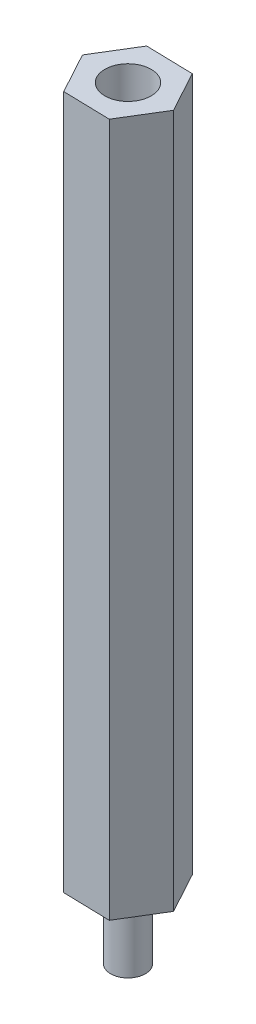
ISO-10303-21;
HEADER;
FILE_DESCRIPTION(('STEP AP214'),'2;1');
FILE_NAME('part.step','',(''),(''),'','','');
FILE_SCHEMA(('AUTOMOTIVE_DESIGN { 1 0 10303 214 1 1 1 1 }'));
ENDSEC;
DATA;
#1=APPLICATION_CONTEXT('core data for automotive mechanical design processes');
#2=APPLICATION_PROTOCOL_DEFINITION('international standard','automotive_design',2000,#1);
#3=PRODUCT_CONTEXT('',#1,'mechanical');
#4=PRODUCT('Part','Part','',(#3));
#5=PRODUCT_RELATED_PRODUCT_CATEGORY('part','',(#4));
#6=PRODUCT_DEFINITION_FORMATION('','',#4);
#7=PRODUCT_DEFINITION_CONTEXT('part definition',#1,'design');
#8=PRODUCT_DEFINITION('design','',#6,#7);
#9=PRODUCT_DEFINITION_SHAPE('','',#8);
#10=(LENGTH_UNIT() NAMED_UNIT(*) SI_UNIT(.MILLI.,.METRE.));
#11=(NAMED_UNIT(*) PLANE_ANGLE_UNIT() SI_UNIT($,.RADIAN.));
#12=(NAMED_UNIT(*) SI_UNIT($,.STERADIAN.) SOLID_ANGLE_UNIT());
#13=UNCERTAINTY_MEASURE_WITH_UNIT(LENGTH_MEASURE(1.E-05),#10,'distance_accuracy_value','');
#14=(GEOMETRIC_REPRESENTATION_CONTEXT(3) GLOBAL_UNCERTAINTY_ASSIGNED_CONTEXT((#13)) GLOBAL_UNIT_ASSIGNED_CONTEXT((#10,
#11,#12)) REPRESENTATION_CONTEXT('',''));
#15=CARTESIAN_POINT('',(0.,0.,0.));
#16=DIRECTION('',(0.,0.,1.));
#17=DIRECTION('',(1.,0.,0.));
#18=AXIS2_PLACEMENT_3D('',#15,#16,#17);
#19=CARTESIAN_POINT('',(-2.10856113065434,60.,3.44779687505326));
#20=DIRECTION('',(0.0252802878709683,0.,-0.999680402451284));
#21=DIRECTION('',(-0.999680402451284,0.,-0.0252802878709683));
#22=AXIS2_PLACEMENT_3D('',#19,#20,#21);
#23=PLANE('',#22);
#24=DIRECTION('',(0.999680402451284,0.,0.0252802878709683));
#25=VECTOR('',#24,1.);
#26=CARTESIAN_POINT('',(-2.10856113065434,0.,3.44779687505326));
#27=LINE('',#26,#25);
#28=CARTESIAN_POINT('',(-2.10856113065434,0.,3.44779687505326));
#29=VERTEX_POINT('',#28);
#30=CARTESIAN_POINT('',(1.93159911555756,0.,3.54996594210573));
#31=VERTEX_POINT('',#30);
#32=EDGE_CURVE('E125',#29,#31,#27,.T.);
#33=ORIENTED_EDGE('',*,*,#32,.T.);
#34=DIRECTION('',(0.,-1.,0.));
#35=VECTOR('',#34,1.);
#36=CARTESIAN_POINT('',(1.93159911555756,60.,3.54996594210573));
#37=LINE('',#36,#35);
#38=CARTESIAN_POINT('',(1.93159911555756,60.,3.54996594210573));
#39=VERTEX_POINT('',#38);
#40=EDGE_CURVE('E42',#39,#31,#37,.T.);
#41=ORIENTED_EDGE('',*,*,#40,.F.);
#42=DIRECTION('',(0.999680402451284,0.,0.0252802878709683));
#43=VECTOR('',#42,1.);
#44=CARTESIAN_POINT('',(-2.10856113065434,60.,3.44779687505326));
#45=LINE('',#44,#43);
#46=CARTESIAN_POINT('',(-2.10856113065434,60.,3.44779687505326));
#47=VERTEX_POINT('',#46);
#48=EDGE_CURVE('E136',#47,#39,#45,.T.);
#49=ORIENTED_EDGE('',*,*,#48,.F.);
#50=DIRECTION('',(0.,-1.,0.));
#51=VECTOR('',#50,1.);
#52=CARTESIAN_POINT('',(-2.10856113065434,60.,3.44779687505326));
#53=LINE('',#52,#51);
#54=EDGE_CURVE('E121',#47,#29,#53,.T.);
#55=ORIENTED_EDGE('',*,*,#54,.T.);
#56=EDGE_LOOP('',(#33,#41,#49,#55));
#57=FACE_BOUND('',#56,.T.);
#58=ADVANCED_FACE('F39',(#57),#23,.F.);
#59=CARTESIAN_POINT('',(1.93159911555756,60.,3.54996594210573));
#60=DIRECTION('',(-0.853108480252779,0.,-0.521733572736884));
#61=DIRECTION('',(-0.521733572736884,0.,0.853108480252779));
#62=AXIS2_PLACEMENT_3D('',#59,#60,#61);
#63=PLANE('',#62);
#64=DIRECTION('',(0.521733572736884,0.,-0.853108480252779));
#65=VECTOR('',#64,1.);
#66=CARTESIAN_POINT('',(1.93159911555756,0.,3.54996594210573));
#67=LINE('',#66,#65);
#68=CARTESIAN_POINT('',(4.0401602462119,0.,0.102169067052462));
#69=VERTEX_POINT('',#68);
#70=EDGE_CURVE('E128',#31,#69,#67,.T.);
#71=ORIENTED_EDGE('',*,*,#70,.T.);
#72=DIRECTION('',(0.,-1.,0.));
#73=VECTOR('',#72,1.);
#74=CARTESIAN_POINT('',(4.0401602462119,60.,0.102169067052462));
#75=LINE('',#74,#73);
#76=CARTESIAN_POINT('',(4.0401602462119,60.,0.102169067052462));
#77=VERTEX_POINT('',#76);
#78=EDGE_CURVE('E139',#77,#69,#75,.T.);
#79=ORIENTED_EDGE('',*,*,#78,.F.);
#80=DIRECTION('',(0.521733572736884,0.,-0.853108480252779));
#81=VECTOR('',#80,1.);
#82=CARTESIAN_POINT('',(1.93159911555756,60.,3.54996594210573));
#83=LINE('',#82,#81);
#84=EDGE_CURVE('E94',#39,#77,#83,.T.);
#85=ORIENTED_EDGE('',*,*,#84,.F.);
#86=ORIENTED_EDGE('',*,*,#40,.T.);
#87=EDGE_LOOP('',(#71,#79,#85,#86));
#88=FACE_BOUND('',#87,.T.);
#89=ADVANCED_FACE('F144',(#88),#63,.F.);
#90=CARTESIAN_POINT('',(4.0401602462119,60.,0.102169067052462));
#91=DIRECTION('',(-0.878388768123747,0.,0.4779468297144));
#92=DIRECTION('',(0.4779468297144,0.,0.878388768123747));
#93=AXIS2_PLACEMENT_3D('',#90,#91,#92);
#94=PLANE('',#93);
#95=DIRECTION('',(-0.4779468297144,0.,-0.878388768123747));
#96=VECTOR('',#95,1.);
#97=CARTESIAN_POINT('',(4.0401602462119,0.,0.102169067052462));
#98=LINE('',#97,#96);
#99=CARTESIAN_POINT('',(2.10856113065434,0.,-3.44779687505326));
#100=VERTEX_POINT('',#99);
#101=EDGE_CURVE('E131',#69,#100,#98,.T.);
#102=ORIENTED_EDGE('',*,*,#101,.T.);
#103=DIRECTION('',(0.,-1.,0.));
#104=VECTOR('',#103,1.);
#105=CARTESIAN_POINT('',(2.10856113065434,60.,-3.44779687505326));
#106=LINE('',#105,#104);
#107=CARTESIAN_POINT('',(2.10856113065434,60.,-3.44779687505326));
#108=VERTEX_POINT('',#107);
#109=EDGE_CURVE('E116',#108,#100,#106,.T.);
#110=ORIENTED_EDGE('',*,*,#109,.F.);
#111=DIRECTION('',(-0.4779468297144,0.,-0.878388768123747));
#112=VECTOR('',#111,1.);
#113=CARTESIAN_POINT('',(4.0401602462119,60.,0.102169067052462));
#114=LINE('',#113,#112);
#115=EDGE_CURVE('E107',#77,#108,#114,.T.);
#116=ORIENTED_EDGE('',*,*,#115,.F.);
#117=ORIENTED_EDGE('',*,*,#78,.T.);
#118=EDGE_LOOP('',(#102,#110,#116,#117));
#119=FACE_BOUND('',#118,.T.);
#120=ADVANCED_FACE('F150',(#119),#94,.F.);
#121=CARTESIAN_POINT('',(2.10856113065434,60.,-3.44779687505326));
#122=DIRECTION('',(-0.0252802878709679,0.,0.999680402451284));
#123=DIRECTION('',(0.999680402451284,0.,0.0252802878709679));
#124=AXIS2_PLACEMENT_3D('',#121,#122,#123);
#125=PLANE('',#124);
#126=DIRECTION('',(-0.999680402451284,0.,-0.0252802878709679));
#127=VECTOR('',#126,1.);
#128=CARTESIAN_POINT('',(2.10856113065434,0.,-3.44779687505326));
#129=LINE('',#128,#127);
#130=CARTESIAN_POINT('',(-1.93159911555756,0.,-3.54996594210573));
#131=VERTEX_POINT('',#130);
#132=EDGE_CURVE('E115',#100,#131,#129,.T.);
#133=ORIENTED_EDGE('',*,*,#132,.T.);
#134=DIRECTION('',(0.,-1.,0.));
#135=VECTOR('',#134,1.);
#136=CARTESIAN_POINT('',(-1.93159911555756,60.,-3.54996594210573));
#137=LINE('',#136,#135);
#138=CARTESIAN_POINT('',(-1.93159911555756,60.,-3.54996594210573));
#139=VERTEX_POINT('',#138);
#140=EDGE_CURVE('E112',#139,#131,#137,.T.);
#141=ORIENTED_EDGE('',*,*,#140,.F.);
#142=DIRECTION('',(-0.999680402451284,0.,-0.0252802878709679));
#143=VECTOR('',#142,1.);
#144=CARTESIAN_POINT('',(2.10856113065434,60.,-3.44779687505326));
#145=LINE('',#144,#143);
#146=EDGE_CURVE('E101',#108,#139,#145,.T.);
#147=ORIENTED_EDGE('',*,*,#146,.F.);
#148=ORIENTED_EDGE('',*,*,#109,.T.);
#149=EDGE_LOOP('',(#133,#141,#147,#148));
#150=FACE_BOUND('',#149,.T.);
#151=ADVANCED_FACE('F113',(#150),#125,.F.);
#152=CARTESIAN_POINT('',(-1.93159911555756,60.,-3.54996594210573));
#153=DIRECTION('',(0.853108480252779,0.,0.521733572736884));
#154=DIRECTION('',(0.521733572736884,0.,-0.853108480252779));
#155=AXIS2_PLACEMENT_3D('',#152,#153,#154);
#156=PLANE('',#155);
#157=DIRECTION('',(-0.521733572736884,0.,0.853108480252779));
#158=VECTOR('',#157,1.);
#159=CARTESIAN_POINT('',(-1.93159911555756,0.,-3.54996594210573));
#160=LINE('',#159,#158);
#161=CARTESIAN_POINT('',(-4.0401602462119,0.,-0.102169067052463));
#162=VERTEX_POINT('',#161);
#163=EDGE_CURVE('E79',#131,#162,#160,.T.);
#164=ORIENTED_EDGE('',*,*,#163,.T.);
#165=DIRECTION('',(0.,-1.,0.));
#166=VECTOR('',#165,1.);
#167=CARTESIAN_POINT('',(-4.0401602462119,60.,-0.102169067052463));
#168=LINE('',#167,#166);
#169=CARTESIAN_POINT('',(-4.0401602462119,60.,-0.102169067052463));
#170=VERTEX_POINT('',#169);
#171=EDGE_CURVE('E117',#170,#162,#168,.T.);
#172=ORIENTED_EDGE('',*,*,#171,.F.);
#173=DIRECTION('',(-0.521733572736884,0.,0.853108480252779));
#174=VECTOR('',#173,1.);
#175=CARTESIAN_POINT('',(-1.93159911555756,60.,-3.54996594210573));
#176=LINE('',#175,#174);
#177=EDGE_CURVE('E105',#139,#170,#176,.T.);
#178=ORIENTED_EDGE('',*,*,#177,.F.);
#179=ORIENTED_EDGE('',*,*,#140,.T.);
#180=EDGE_LOOP('',(#164,#172,#178,#179));
#181=FACE_BOUND('',#180,.T.);
#182=ADVANCED_FACE('F119',(#181),#156,.F.);
#183=CARTESIAN_POINT('',(-4.0401602462119,60.,-0.102169067052463));
#184=DIRECTION('',(0.878388768123747,0.,-0.4779468297144));
#185=DIRECTION('',(-0.4779468297144,0.,-0.878388768123747));
#186=AXIS2_PLACEMENT_3D('',#183,#184,#185);
#187=PLANE('',#186);
#188=DIRECTION('',(0.4779468297144,0.,0.878388768123747));
#189=VECTOR('',#188,1.);
#190=CARTESIAN_POINT('',(-4.0401602462119,0.,-0.102169067052463));
#191=LINE('',#190,#189);
#192=EDGE_CURVE('E85',#162,#29,#191,.T.);
#193=ORIENTED_EDGE('',*,*,#192,.T.);
#194=ORIENTED_EDGE('',*,*,#54,.F.);
#195=DIRECTION('',(0.4779468297144,0.,0.878388768123747));
#196=VECTOR('',#195,1.);
#197=CARTESIAN_POINT('',(-4.0401602462119,60.,-0.102169067052463));
#198=LINE('',#197,#196);
#199=EDGE_CURVE('E56',#170,#47,#198,.T.);
#200=ORIENTED_EDGE('',*,*,#199,.F.);
#201=ORIENTED_EDGE('',*,*,#171,.T.);
#202=EDGE_LOOP('',(#193,#194,#200,#201));
#203=FACE_BOUND('',#202,.T.);
#204=ADVANCED_FACE('F182',(#203),#187,.F.);
#205=CARTESIAN_POINT('',(0.,60.,0.));
#206=DIRECTION('',(0.,1.,0.));
#207=DIRECTION('',(0.,0.,1.));
#208=AXIS2_PLACEMENT_3D('',#205,#206,#207);
#209=PLANE('',#208);
#210=CARTESIAN_POINT('',(0.,60.,0.));
#211=DIRECTION('',(0.,1.,0.));
#212=DIRECTION('',(0.,0.,1.));
#213=AXIS2_PLACEMENT_3D('',#210,#211,#212);
#214=CIRCLE('',#213,2.);
#215=CARTESIAN_POINT('',(0.,60.,2.));
#216=VERTEX_POINT('',#215);
#217=EDGE_CURVE('E154',#216,#216,#214,.T.);
#218=ORIENTED_EDGE('',*,*,#217,.F.);
#219=EDGE_LOOP('',(#218));
#220=FACE_BOUND('',#219,.T.);
#221=ORIENTED_EDGE('',*,*,#48,.T.);
#222=ORIENTED_EDGE('',*,*,#84,.T.);
#223=ORIENTED_EDGE('',*,*,#115,.T.);
#224=ORIENTED_EDGE('',*,*,#146,.T.);
#225=ORIENTED_EDGE('',*,*,#177,.T.);
#226=ORIENTED_EDGE('',*,*,#199,.T.);
#227=EDGE_LOOP('',(#221,#222,#223,#224,#225,#226));
#228=FACE_BOUND('',#227,.T.);
#229=ADVANCED_FACE('F103',(#220,#228),#209,.T.);
#230=CARTESIAN_POINT('',(0.,0.,0.));
#231=DIRECTION('',(0.,1.,0.));
#232=DIRECTION('',(0.,0.,1.));
#233=AXIS2_PLACEMENT_3D('',#230,#231,#232);
#234=PLANE('',#233);
#235=CARTESIAN_POINT('',(0.,0.,0.));
#236=DIRECTION('',(0.,-1.,0.));
#237=DIRECTION('',(0.,0.,-1.));
#238=AXIS2_PLACEMENT_3D('',#235,#236,#237);
#239=CIRCLE('',#238,1.5);
#240=CARTESIAN_POINT('',(0.,0.,-1.5));
#241=VERTEX_POINT('',#240);
#242=EDGE_CURVE('E11',#241,#241,#239,.T.);
#243=ORIENTED_EDGE('',*,*,#242,.F.);
#244=EDGE_LOOP('',(#243));
#245=FACE_BOUND('',#244,.T.);
#246=ORIENTED_EDGE('',*,*,#32,.F.);
#247=ORIENTED_EDGE('',*,*,#192,.F.);
#248=ORIENTED_EDGE('',*,*,#163,.F.);
#249=ORIENTED_EDGE('',*,*,#132,.F.);
#250=ORIENTED_EDGE('',*,*,#101,.F.);
#251=ORIENTED_EDGE('',*,*,#70,.F.);
#252=EDGE_LOOP('',(#246,#247,#248,#249,#250,#251));
#253=FACE_BOUND('',#252,.T.);
#254=ADVANCED_FACE('F149',(#245,#253),#234,.F.);
#255=CARTESIAN_POINT('',(0.,52.,0.));
#256=DIRECTION('',(0.,1.,0.));
#257=DIRECTION('',(0.,0.,1.));
#258=AXIS2_PLACEMENT_3D('',#255,#256,#257);
#259=CYLINDRICAL_SURFACE('',#258,2.);
#260=CARTESIAN_POINT('',(0.,52.,0.));
#261=DIRECTION('',(0.,1.,0.));
#262=DIRECTION('',(0.,0.,1.));
#263=AXIS2_PLACEMENT_3D('',#260,#261,#262);
#264=CIRCLE('',#263,2.);
#265=CARTESIAN_POINT('',(0.,52.,2.));
#266=VERTEX_POINT('',#265);
#267=EDGE_CURVE('E129',#266,#266,#264,.T.);
#268=ORIENTED_EDGE('',*,*,#267,.F.);
#269=EDGE_LOOP('',(#268));
#270=FACE_BOUND('',#269,.T.);
#271=ORIENTED_EDGE('',*,*,#217,.T.);
#272=EDGE_LOOP('',(#271));
#273=FACE_BOUND('',#272,.T.);
#274=ADVANCED_FACE('F173',(#270,#273),#259,.F.);
#275=CARTESIAN_POINT('',(0.,52.,0.));
#276=DIRECTION('',(0.,1.,0.));
#277=DIRECTION('',(0.,0.,1.));
#278=AXIS2_PLACEMENT_3D('',#275,#276,#277);
#279=PLANE('',#278);
#280=ORIENTED_EDGE('',*,*,#267,.T.);
#281=EDGE_LOOP('',(#280));
#282=FACE_BOUND('',#281,.T.);
#283=ADVANCED_FACE('F168',(#282),#279,.T.);
#284=CARTESIAN_POINT('',(0.,-6.,0.));
#285=DIRECTION('',(0.,1.,0.));
#286=DIRECTION('',(0.,0.,1.));
#287=AXIS2_PLACEMENT_3D('',#284,#285,#286);
#288=CYLINDRICAL_SURFACE('',#287,1.5);
#289=CARTESIAN_POINT('',(0.,-6.,0.));
#290=DIRECTION('',(0.,-1.,0.));
#291=DIRECTION('',(0.,0.,-1.));
#292=AXIS2_PLACEMENT_3D('',#289,#290,#291);
#293=CIRCLE('',#292,1.5);
#294=CARTESIAN_POINT('',(0.,-6.,-1.5));
#295=VERTEX_POINT('',#294);
#296=EDGE_CURVE('E157',#295,#295,#293,.T.);
#297=ORIENTED_EDGE('',*,*,#296,.F.);
#298=EDGE_LOOP('',(#297));
#299=FACE_BOUND('',#298,.T.);
#300=ORIENTED_EDGE('',*,*,#242,.T.);
#301=EDGE_LOOP('',(#300));
#302=FACE_BOUND('',#301,.T.);
#303=ADVANCED_FACE('F165',(#299,#302),#288,.T.);
#304=CARTESIAN_POINT('',(0.,-6.,0.));
#305=DIRECTION('',(0.,-1.,0.));
#306=DIRECTION('',(0.,0.,-1.));
#307=AXIS2_PLACEMENT_3D('',#304,#305,#306);
#308=PLANE('',#307);
#309=ORIENTED_EDGE('',*,*,#296,.T.);
#310=EDGE_LOOP('',(#309));
#311=FACE_BOUND('',#310,.T.);
#312=ADVANCED_FACE('F163',(#311),#308,.T.);
#313=CLOSED_SHELL('',(#58,#89,#120,#151,#182,#204,#229,#254,#274,#283,#303,#312));
#314=MANIFOLD_SOLID_BREP('B2',#313);
#315=ADVANCED_BREP_SHAPE_REPRESENTATION('',(#18,#314),#14);
#316=SHAPE_DEFINITION_REPRESENTATION(#9,#315);
ENDSEC;
END-ISO-10303-21;
